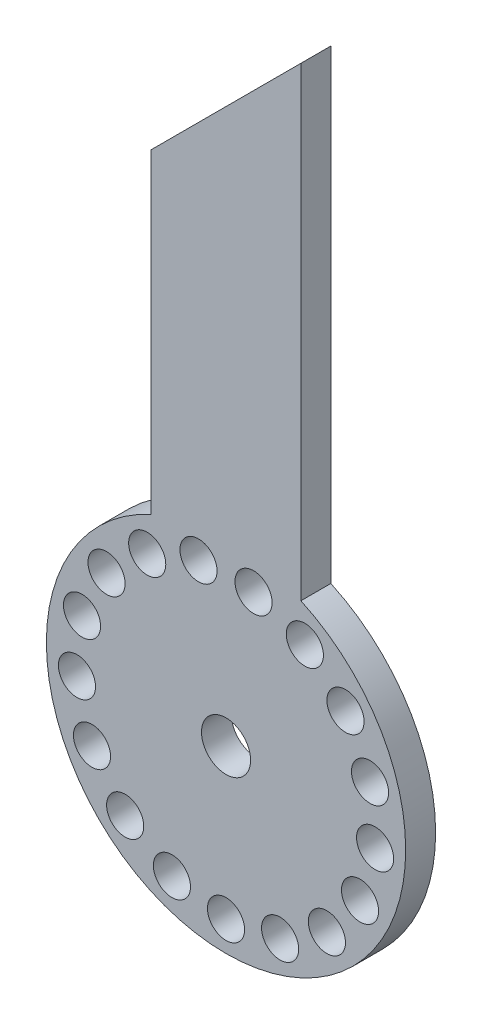
ISO-10303-21;
HEADER;
FILE_DESCRIPTION(('STEP AP214'),'2;1');
FILE_NAME('part.step','',(''),(''),'','','');
FILE_SCHEMA(('AUTOMOTIVE_DESIGN { 1 0 10303 214 1 1 1 1 }'));
ENDSEC;
DATA;
#1=APPLICATION_CONTEXT('core data for automotive mechanical design processes');
#2=APPLICATION_PROTOCOL_DEFINITION('international standard','automotive_design',2000,#1);
#3=PRODUCT_CONTEXT('',#1,'mechanical');
#4=PRODUCT('Part','Part','',(#3));
#5=PRODUCT_RELATED_PRODUCT_CATEGORY('part','',(#4));
#6=PRODUCT_DEFINITION_FORMATION('','',#4);
#7=PRODUCT_DEFINITION_CONTEXT('part definition',#1,'design');
#8=PRODUCT_DEFINITION('design','',#6,#7);
#9=PRODUCT_DEFINITION_SHAPE('','',#8);
#10=(LENGTH_UNIT() NAMED_UNIT(*) SI_UNIT(.MILLI.,.METRE.));
#11=(NAMED_UNIT(*) PLANE_ANGLE_UNIT() SI_UNIT($,.RADIAN.));
#12=(NAMED_UNIT(*) SI_UNIT($,.STERADIAN.) SOLID_ANGLE_UNIT());
#13=UNCERTAINTY_MEASURE_WITH_UNIT(LENGTH_MEASURE(1.E-05),#10,'distance_accuracy_value','');
#14=(GEOMETRIC_REPRESENTATION_CONTEXT(3) GLOBAL_UNCERTAINTY_ASSIGNED_CONTEXT((#13)) GLOBAL_UNIT_ASSIGNED_CONTEXT((#10,
#11,#12)) REPRESENTATION_CONTEXT('',''));
#15=CARTESIAN_POINT('',(0.,0.,0.));
#16=DIRECTION('',(0.,0.,1.));
#17=DIRECTION('',(1.,0.,0.));
#18=AXIS2_PLACEMENT_3D('',#15,#16,#17);
#19=CARTESIAN_POINT('',(0.,0.,5.));
#20=DIRECTION('',(0.,0.,-1.));
#21=DIRECTION('',(-1.,0.,0.));
#22=AXIS2_PLACEMENT_3D('',#19,#20,#21);
#23=CYLINDRICAL_SURFACE('',#22,30.);
#24=CARTESIAN_POINT('',(0.,0.,0.));
#25=DIRECTION('',(0.,0.,1.));
#26=DIRECTION('',(1.,0.,0.));
#27=AXIS2_PLACEMENT_3D('',#24,#25,#26);
#28=CIRCLE('',#27,30.);
#29=CARTESIAN_POINT('',(-12.5,27.2717802865893,0.));
#30=VERTEX_POINT('',#29);
#31=CARTESIAN_POINT('',(12.5,27.2717802865893,0.));
#32=VERTEX_POINT('',#31);
#33=EDGE_CURVE('E93',#30,#32,#28,.T.);
#34=ORIENTED_EDGE('',*,*,#33,.T.);
#35=DIRECTION('',(0.,0.,-1.));
#36=VECTOR('',#35,1.);
#37=CARTESIAN_POINT('',(12.5,27.2717802865893,5.));
#38=LINE('',#37,#36);
#39=CARTESIAN_POINT('',(12.5,27.2717802865893,5.));
#40=VERTEX_POINT('',#39);
#41=EDGE_CURVE('E11',#40,#32,#38,.T.);
#42=ORIENTED_EDGE('',*,*,#41,.F.);
#43=CARTESIAN_POINT('',(0.,0.,5.));
#44=DIRECTION('',(0.,0.,1.));
#45=DIRECTION('',(1.,0.,0.));
#46=AXIS2_PLACEMENT_3D('',#43,#44,#45);
#47=CIRCLE('',#46,30.);
#48=CARTESIAN_POINT('',(-12.5,27.2717802865893,5.));
#49=VERTEX_POINT('',#48);
#50=EDGE_CURVE('E94',#49,#40,#47,.T.);
#51=ORIENTED_EDGE('',*,*,#50,.F.);
#52=DIRECTION('',(0.,0.,-1.));
#53=VECTOR('',#52,1.);
#54=CARTESIAN_POINT('',(-12.5,27.2717802865893,5.));
#55=LINE('',#54,#53);
#56=EDGE_CURVE('E43',#49,#30,#55,.T.);
#57=ORIENTED_EDGE('',*,*,#56,.T.);
#58=EDGE_LOOP('',(#34,#42,#51,#57));
#59=FACE_BOUND('',#58,.T.);
#60=ADVANCED_FACE('F35',(#59),#23,.T.);
#61=CARTESIAN_POINT('',(12.5,150.,5.));
#62=DIRECTION('',(-1.,0.,0.));
#63=DIRECTION('',(0.,-1.,0.));
#64=AXIS2_PLACEMENT_3D('',#61,#62,#63);
#65=PLANE('',#64);
#66=DIRECTION('',(0.,1.,0.));
#67=VECTOR('',#66,1.);
#68=CARTESIAN_POINT('',(12.5,150.,0.));
#69=LINE('',#68,#67);
#70=CARTESIAN_POINT('',(12.5,105.,0.));
#71=VERTEX_POINT('',#70);
#72=EDGE_CURVE('E63',#32,#71,#69,.T.);
#73=ORIENTED_EDGE('',*,*,#72,.T.);
#74=DIRECTION('',(0.,0.,1.));
#75=VECTOR('',#74,1.);
#76=CARTESIAN_POINT('',(12.5,105.,0.));
#77=LINE('',#76,#75);
#78=CARTESIAN_POINT('',(12.5,105.,5.));
#79=VERTEX_POINT('',#78);
#80=EDGE_CURVE('E83',#71,#79,#77,.T.);
#81=ORIENTED_EDGE('',*,*,#80,.T.);
#82=DIRECTION('',(0.,1.,0.));
#83=VECTOR('',#82,1.);
#84=CARTESIAN_POINT('',(12.5,150.,5.));
#85=LINE('',#84,#83);
#86=EDGE_CURVE('E96',#40,#79,#85,.T.);
#87=ORIENTED_EDGE('',*,*,#86,.F.);
#88=ORIENTED_EDGE('',*,*,#41,.T.);
#89=EDGE_LOOP('',(#73,#81,#87,#88));
#90=FACE_BOUND('',#89,.T.);
#91=ADVANCED_FACE('F218',(#90),#65,.F.);
#92=CARTESIAN_POINT('',(-12.5,150.,5.));
#93=DIRECTION('',(1.,0.,0.));
#94=DIRECTION('',(0.,1.,0.));
#95=AXIS2_PLACEMENT_3D('',#92,#93,#94);
#96=PLANE('',#95);
#97=DIRECTION('',(0.,-1.,0.));
#98=VECTOR('',#97,1.);
#99=CARTESIAN_POINT('',(-12.5,150.,5.));
#100=LINE('',#99,#98);
#101=CARTESIAN_POINT('',(-12.5,79.9999999999999,5.));
#102=VERTEX_POINT('',#101);
#103=EDGE_CURVE('E51',#102,#49,#100,.T.);
#104=ORIENTED_EDGE('',*,*,#103,.F.);
#105=DIRECTION('',(0.,0.,1.));
#106=VECTOR('',#105,1.);
#107=CARTESIAN_POINT('',(-12.5,79.9999999999999,0.));
#108=LINE('',#107,#106);
#109=CARTESIAN_POINT('',(-12.5,79.9999999999999,0.));
#110=VERTEX_POINT('',#109);
#111=EDGE_CURVE('E81',#110,#102,#108,.T.);
#112=ORIENTED_EDGE('',*,*,#111,.F.);
#113=DIRECTION('',(0.,-1.,0.));
#114=VECTOR('',#113,1.);
#115=CARTESIAN_POINT('',(-12.5,150.,0.));
#116=LINE('',#115,#114);
#117=EDGE_CURVE('E88',#110,#30,#116,.T.);
#118=ORIENTED_EDGE('',*,*,#117,.T.);
#119=ORIENTED_EDGE('',*,*,#56,.F.);
#120=EDGE_LOOP('',(#104,#112,#118,#119));
#121=FACE_BOUND('',#120,.T.);
#122=ADVANCED_FACE('F87',(#121),#96,.F.);
#123=CARTESIAN_POINT('',(0.,0.,5.));
#124=DIRECTION('',(0.,0.,1.));
#125=DIRECTION('',(1.,0.,0.));
#126=AXIS2_PLACEMENT_3D('',#123,#124,#125);
#127=PLANE('',#126);
#128=DIRECTION('',(0.707106781186548,0.707106781186547,0.));
#129=VECTOR('',#128,1.);
#130=CARTESIAN_POINT('',(-12.5,79.9999999999999,5.));
#131=LINE('',#130,#129);
#132=EDGE_CURVE('E70',#102,#79,#131,.T.);
#133=ORIENTED_EDGE('',*,*,#132,.F.);
#134=ORIENTED_EDGE('',*,*,#103,.T.);
#135=ORIENTED_EDGE('',*,*,#50,.T.);
#136=ORIENTED_EDGE('',*,*,#86,.T.);
#137=EDGE_LOOP('',(#133,#134,#135,#136));
#138=FACE_BOUND('',#137,.T.);
#139=CARTESIAN_POINT('',(9.03104165467851,-23.311805735109,5.));
#140=DIRECTION('',(0.,0.,1.));
#141=DIRECTION('',(1.,0.,0.));
#142=AXIS2_PLACEMENT_3D('',#139,#140,#141);
#143=CIRCLE('',#142,3.1);
#144=CARTESIAN_POINT('',(12.1310416546785,-23.311805735109,5.));
#145=VERTEX_POINT('',#144);
#146=EDGE_CURVE('E211',#145,#145,#143,.T.);
#147=ORIENTED_EDGE('',*,*,#146,.F.);
#148=EDGE_LOOP('',(#147));
#149=FACE_BOUND('',#148,.T.);
#150=CARTESIAN_POINT('',(16.8423910911637,-18.4752229305167,5.));
#151=DIRECTION('',(0.,0.,1.));
#152=DIRECTION('',(1.,0.,0.));
#153=AXIS2_PLACEMENT_3D('',#150,#151,#152);
#154=CIRCLE('',#153,3.1);
#155=CARTESIAN_POINT('',(19.9423910911637,-18.4752229305167,5.));
#156=VERTEX_POINT('',#155);
#157=EDGE_CURVE('E205',#156,#156,#154,.T.);
#158=ORIENTED_EDGE('',*,*,#157,.F.);
#159=EDGE_LOOP('',(#158));
#160=FACE_BOUND('',#159,.T.);
#161=CARTESIAN_POINT('',(22.3790822838764,-11.1434588944137,5.));
#162=DIRECTION('',(0.,0.,1.));
#163=DIRECTION('',(1.,0.,0.));
#164=AXIS2_PLACEMENT_3D('',#161,#162,#163);
#165=CIRCLE('',#164,3.1);
#166=CARTESIAN_POINT('',(25.4790822838764,-11.1434588944137,5.));
#167=VERTEX_POINT('',#166);
#168=EDGE_CURVE('E199',#167,#167,#165,.T.);
#169=ORIENTED_EDGE('',*,*,#168,.F.);
#170=EDGE_LOOP('',(#169));
#171=FACE_BOUND('',#170,.T.);
#172=CARTESIAN_POINT('',(24.8933544073758,-2.30670898658283,5.));
#173=DIRECTION('',(0.,0.,1.));
#174=DIRECTION('',(1.,0.,0.));
#175=AXIS2_PLACEMENT_3D('',#172,#173,#174);
#176=CIRCLE('',#175,3.1);
#177=CARTESIAN_POINT('',(27.9933544073758,-2.30670898658283,5.));
#178=VERTEX_POINT('',#177);
#179=EDGE_CURVE('E193',#178,#178,#176,.T.);
#180=ORIENTED_EDGE('',*,*,#179,.F.);
#181=EDGE_LOOP('',(#180));
#182=FACE_BOUND('',#181,.T.);
#183=CARTESIAN_POINT('',(24.0456410793205,6.84157475180182,5.));
#184=DIRECTION('',(0.,0.,1.));
#185=DIRECTION('',(1.,0.,0.));
#186=AXIS2_PLACEMENT_3D('',#183,#184,#185);
#187=CIRCLE('',#186,3.1);
#188=CARTESIAN_POINT('',(27.1456410793206,6.84157475180182,5.));
#189=VERTEX_POINT('',#188);
#190=EDGE_CURVE('E187',#189,#189,#187,.T.);
#191=ORIENTED_EDGE('',*,*,#190,.F.);
#192=EDGE_LOOP('',(#191));
#193=FACE_BOUND('',#192,.T.);
#194=CARTESIAN_POINT('',(19.9504306820061,15.0658659094812,5.));
#195=DIRECTION('',(0.,0.,1.));
#196=DIRECTION('',(1.,0.,0.));
#197=AXIS2_PLACEMENT_3D('',#194,#195,#196);
#198=CIRCLE('',#197,3.1);
#199=CARTESIAN_POINT('',(23.0504306820061,15.0658659094812,5.));
#200=VERTEX_POINT('',#199);
#201=EDGE_CURVE('E181',#200,#200,#198,.T.);
#202=ORIENTED_EDGE('',*,*,#201,.F.);
#203=EDGE_LOOP('',(#202));
#204=FACE_BOUND('',#203,.T.);
#205=CARTESIAN_POINT('',(13.1608040719341,21.2554283932402,5.));
#206=DIRECTION('',(0.,0.,1.));
#207=DIRECTION('',(1.,0.,0.));
#208=AXIS2_PLACEMENT_3D('',#205,#206,#207);
#209=CIRCLE('',#208,3.1);
#210=CARTESIAN_POINT('',(16.2608040719341,21.2554283932402,5.));
#211=VERTEX_POINT('',#210);
#212=EDGE_CURVE('E175',#211,#211,#209,.T.);
#213=ORIENTED_EDGE('',*,*,#212,.F.);
#214=EDGE_LOOP('',(#213));
#215=FACE_BOUND('',#214,.T.);
#216=CARTESIAN_POINT('',(4.59373794541444,24.5743274920975,5.));
#217=DIRECTION('',(0.,0.,1.));
#218=DIRECTION('',(1.,0.,0.));
#219=AXIS2_PLACEMENT_3D('',#216,#217,#218);
#220=CIRCLE('',#219,3.1);
#221=CARTESIAN_POINT('',(7.69373794541444,24.5743274920975,5.));
#222=VERTEX_POINT('',#221);
#223=EDGE_CURVE('E169',#222,#222,#220,.T.);
#224=ORIENTED_EDGE('',*,*,#223,.F.);
#225=EDGE_LOOP('',(#224));
#226=FACE_BOUND('',#225,.T.);
#227=CARTESIAN_POINT('',(-4.5937379454141,24.5743274920976,5.));
#228=DIRECTION('',(0.,0.,1.));
#229=DIRECTION('',(1.,0.,0.));
#230=AXIS2_PLACEMENT_3D('',#227,#228,#229);
#231=CIRCLE('',#230,3.1);
#232=CARTESIAN_POINT('',(-1.4937379454141,24.5743274920976,5.));
#233=VERTEX_POINT('',#232);
#234=EDGE_CURVE('E163',#233,#233,#231,.T.);
#235=ORIENTED_EDGE('',*,*,#234,.F.);
#236=EDGE_LOOP('',(#235));
#237=FACE_BOUND('',#236,.T.);
#238=CARTESIAN_POINT('',(-13.1608040719338,21.2554283932404,5.));
#239=DIRECTION('',(0.,0.,1.));
#240=DIRECTION('',(1.,0.,0.));
#241=AXIS2_PLACEMENT_3D('',#238,#239,#240);
#242=CIRCLE('',#241,3.1);
#243=CARTESIAN_POINT('',(-10.0608040719338,21.2554283932404,5.));
#244=VERTEX_POINT('',#243);
#245=EDGE_CURVE('E157',#244,#244,#242,.T.);
#246=ORIENTED_EDGE('',*,*,#245,.F.);
#247=EDGE_LOOP('',(#246));
#248=FACE_BOUND('',#247,.T.);
#249=CARTESIAN_POINT('',(-19.9504306820059,15.0658659094815,5.));
#250=DIRECTION('',(0.,0.,1.));
#251=DIRECTION('',(1.,0.,0.));
#252=AXIS2_PLACEMENT_3D('',#249,#250,#251);
#253=CIRCLE('',#252,3.1);
#254=CARTESIAN_POINT('',(-16.8504306820059,15.0658659094815,5.));
#255=VERTEX_POINT('',#254);
#256=EDGE_CURVE('E151',#255,#255,#253,.T.);
#257=ORIENTED_EDGE('',*,*,#256,.F.);
#258=EDGE_LOOP('',(#257));
#259=FACE_BOUND('',#258,.T.);
#260=CARTESIAN_POINT('',(-24.0456410793205,6.84157475180217,5.));
#261=DIRECTION('',(0.,0.,1.));
#262=DIRECTION('',(1.,0.,0.));
#263=AXIS2_PLACEMENT_3D('',#260,#261,#262);
#264=CIRCLE('',#263,3.1);
#265=CARTESIAN_POINT('',(-20.9456410793205,6.84157475180217,5.));
#266=VERTEX_POINT('',#265);
#267=EDGE_CURVE('E145',#266,#266,#264,.T.);
#268=ORIENTED_EDGE('',*,*,#267,.F.);
#269=EDGE_LOOP('',(#268));
#270=FACE_BOUND('',#269,.T.);
#271=CARTESIAN_POINT('',(-24.8933544073759,-2.30670898658247,5.));
#272=DIRECTION('',(0.,0.,1.));
#273=DIRECTION('',(1.,0.,0.));
#274=AXIS2_PLACEMENT_3D('',#271,#272,#273);
#275=CIRCLE('',#274,3.1);
#276=CARTESIAN_POINT('',(-21.7933544073759,-2.30670898658247,5.));
#277=VERTEX_POINT('',#276);
#278=EDGE_CURVE('E139',#277,#277,#275,.T.);
#279=ORIENTED_EDGE('',*,*,#278,.F.);
#280=EDGE_LOOP('',(#279));
#281=FACE_BOUND('',#280,.T.);
#282=CARTESIAN_POINT('',(-22.3790822838766,-11.1434588944134,5.));
#283=DIRECTION('',(0.,0.,1.));
#284=DIRECTION('',(1.,0.,0.));
#285=AXIS2_PLACEMENT_3D('',#282,#283,#284);
#286=CIRCLE('',#285,3.1);
#287=CARTESIAN_POINT('',(-19.2790822838766,-11.1434588944134,5.));
#288=VERTEX_POINT('',#287);
#289=EDGE_CURVE('E133',#288,#288,#286,.T.);
#290=ORIENTED_EDGE('',*,*,#289,.F.);
#291=EDGE_LOOP('',(#290));
#292=FACE_BOUND('',#291,.T.);
#293=CARTESIAN_POINT('',(-16.842391091164,-18.4752229305165,5.));
#294=DIRECTION('',(0.,0.,1.));
#295=DIRECTION('',(1.,0.,0.));
#296=AXIS2_PLACEMENT_3D('',#293,#294,#295);
#297=CIRCLE('',#296,3.1);
#298=CARTESIAN_POINT('',(-13.742391091164,-18.4752229305165,5.));
#299=VERTEX_POINT('',#298);
#300=EDGE_CURVE('E127',#299,#299,#297,.T.);
#301=ORIENTED_EDGE('',*,*,#300,.F.);
#302=EDGE_LOOP('',(#301));
#303=FACE_BOUND('',#302,.T.);
#304=CARTESIAN_POINT('',(-9.03104165467884,-23.3118057351089,5.));
#305=DIRECTION('',(0.,0.,1.));
#306=DIRECTION('',(1.,0.,0.));
#307=AXIS2_PLACEMENT_3D('',#304,#305,#306);
#308=CIRCLE('',#307,3.1);
#309=CARTESIAN_POINT('',(-5.93104165467884,-23.3118057351089,5.));
#310=VERTEX_POINT('',#309);
#311=EDGE_CURVE('E121',#310,#310,#308,.T.);
#312=ORIENTED_EDGE('',*,*,#311,.F.);
#313=EDGE_LOOP('',(#312));
#314=FACE_BOUND('',#313,.T.);
#315=CARTESIAN_POINT('',(0.,-25.,5.));
#316=DIRECTION('',(0.,0.,1.));
#317=DIRECTION('',(1.,0.,0.));
#318=AXIS2_PLACEMENT_3D('',#315,#316,#317);
#319=CIRCLE('',#318,3.1);
#320=CARTESIAN_POINT('',(3.1,-25.,5.));
#321=VERTEX_POINT('',#320);
#322=EDGE_CURVE('E115',#321,#321,#319,.T.);
#323=ORIENTED_EDGE('',*,*,#322,.F.);
#324=EDGE_LOOP('',(#323));
#325=FACE_BOUND('',#324,.T.);
#326=CARTESIAN_POINT('',(0.,0.,5.));
#327=DIRECTION('',(0.,0.,1.));
#328=DIRECTION('',(1.,0.,0.));
#329=AXIS2_PLACEMENT_3D('',#326,#327,#328);
#330=CIRCLE('',#329,4.1);
#331=CARTESIAN_POINT('',(4.1,0.,5.));
#332=VERTEX_POINT('',#331);
#333=EDGE_CURVE('E107',#332,#332,#330,.T.);
#334=ORIENTED_EDGE('',*,*,#333,.F.);
#335=EDGE_LOOP('',(#334));
#336=FACE_BOUND('',#335,.T.);
#337=ADVANCED_FACE('F219',(#138,#149,#160,#171,#182,#193,#204,#215,#226,#237,#248,#259,#270,
#281,#292,#303,#314,#325,#336),#127,.T.);
#338=CARTESIAN_POINT('',(0.,0.,0.));
#339=DIRECTION('',(0.,0.,1.));
#340=DIRECTION('',(1.,0.,0.));
#341=AXIS2_PLACEMENT_3D('',#338,#339,#340);
#342=PLANE('',#341);
#343=CARTESIAN_POINT('',(9.03104165467851,-23.311805735109,0.));
#344=DIRECTION('',(0.,0.,1.));
#345=DIRECTION('',(1.,0.,0.));
#346=AXIS2_PLACEMENT_3D('',#343,#344,#345);
#347=CIRCLE('',#346,3.1);
#348=CARTESIAN_POINT('',(12.1310416546785,-23.311805735109,0.));
#349=VERTEX_POINT('',#348);
#350=EDGE_CURVE('E208',#349,#349,#347,.T.);
#351=ORIENTED_EDGE('',*,*,#350,.T.);
#352=EDGE_LOOP('',(#351));
#353=FACE_BOUND('',#352,.T.);
#354=CARTESIAN_POINT('',(16.8423910911637,-18.4752229305167,0.));
#355=DIRECTION('',(0.,0.,1.));
#356=DIRECTION('',(1.,0.,0.));
#357=AXIS2_PLACEMENT_3D('',#354,#355,#356);
#358=CIRCLE('',#357,3.1);
#359=CARTESIAN_POINT('',(19.9423910911637,-18.4752229305167,0.));
#360=VERTEX_POINT('',#359);
#361=EDGE_CURVE('E202',#360,#360,#358,.T.);
#362=ORIENTED_EDGE('',*,*,#361,.T.);
#363=EDGE_LOOP('',(#362));
#364=FACE_BOUND('',#363,.T.);
#365=CARTESIAN_POINT('',(22.3790822838764,-11.1434588944137,0.));
#366=DIRECTION('',(0.,0.,1.));
#367=DIRECTION('',(1.,0.,0.));
#368=AXIS2_PLACEMENT_3D('',#365,#366,#367);
#369=CIRCLE('',#368,3.1);
#370=CARTESIAN_POINT('',(25.4790822838764,-11.1434588944137,0.));
#371=VERTEX_POINT('',#370);
#372=EDGE_CURVE('E196',#371,#371,#369,.T.);
#373=ORIENTED_EDGE('',*,*,#372,.T.);
#374=EDGE_LOOP('',(#373));
#375=FACE_BOUND('',#374,.T.);
#376=CARTESIAN_POINT('',(24.8933544073758,-2.30670898658283,0.));
#377=DIRECTION('',(0.,0.,1.));
#378=DIRECTION('',(1.,0.,0.));
#379=AXIS2_PLACEMENT_3D('',#376,#377,#378);
#380=CIRCLE('',#379,3.1);
#381=CARTESIAN_POINT('',(27.9933544073758,-2.30670898658283,0.));
#382=VERTEX_POINT('',#381);
#383=EDGE_CURVE('E190',#382,#382,#380,.T.);
#384=ORIENTED_EDGE('',*,*,#383,.T.);
#385=EDGE_LOOP('',(#384));
#386=FACE_BOUND('',#385,.T.);
#387=CARTESIAN_POINT('',(24.0456410793205,6.84157475180182,0.));
#388=DIRECTION('',(0.,0.,1.));
#389=DIRECTION('',(1.,0.,0.));
#390=AXIS2_PLACEMENT_3D('',#387,#388,#389);
#391=CIRCLE('',#390,3.1);
#392=CARTESIAN_POINT('',(27.1456410793206,6.84157475180182,0.));
#393=VERTEX_POINT('',#392);
#394=EDGE_CURVE('E184',#393,#393,#391,.T.);
#395=ORIENTED_EDGE('',*,*,#394,.T.);
#396=EDGE_LOOP('',(#395));
#397=FACE_BOUND('',#396,.T.);
#398=CARTESIAN_POINT('',(19.9504306820061,15.0658659094812,0.));
#399=DIRECTION('',(0.,0.,1.));
#400=DIRECTION('',(1.,0.,0.));
#401=AXIS2_PLACEMENT_3D('',#398,#399,#400);
#402=CIRCLE('',#401,3.1);
#403=CARTESIAN_POINT('',(23.0504306820061,15.0658659094812,0.));
#404=VERTEX_POINT('',#403);
#405=EDGE_CURVE('E178',#404,#404,#402,.T.);
#406=ORIENTED_EDGE('',*,*,#405,.T.);
#407=EDGE_LOOP('',(#406));
#408=FACE_BOUND('',#407,.T.);
#409=CARTESIAN_POINT('',(13.1608040719341,21.2554283932402,0.));
#410=DIRECTION('',(0.,0.,1.));
#411=DIRECTION('',(1.,0.,0.));
#412=AXIS2_PLACEMENT_3D('',#409,#410,#411);
#413=CIRCLE('',#412,3.1);
#414=CARTESIAN_POINT('',(16.2608040719341,21.2554283932402,0.));
#415=VERTEX_POINT('',#414);
#416=EDGE_CURVE('E172',#415,#415,#413,.T.);
#417=ORIENTED_EDGE('',*,*,#416,.T.);
#418=EDGE_LOOP('',(#417));
#419=FACE_BOUND('',#418,.T.);
#420=CARTESIAN_POINT('',(4.59373794541444,24.5743274920975,0.));
#421=DIRECTION('',(0.,0.,1.));
#422=DIRECTION('',(1.,0.,0.));
#423=AXIS2_PLACEMENT_3D('',#420,#421,#422);
#424=CIRCLE('',#423,3.1);
#425=CARTESIAN_POINT('',(7.69373794541444,24.5743274920975,0.));
#426=VERTEX_POINT('',#425);
#427=EDGE_CURVE('E166',#426,#426,#424,.T.);
#428=ORIENTED_EDGE('',*,*,#427,.T.);
#429=EDGE_LOOP('',(#428));
#430=FACE_BOUND('',#429,.T.);
#431=CARTESIAN_POINT('',(-4.5937379454141,24.5743274920976,0.));
#432=DIRECTION('',(0.,0.,1.));
#433=DIRECTION('',(1.,0.,0.));
#434=AXIS2_PLACEMENT_3D('',#431,#432,#433);
#435=CIRCLE('',#434,3.1);
#436=CARTESIAN_POINT('',(-1.4937379454141,24.5743274920976,0.));
#437=VERTEX_POINT('',#436);
#438=EDGE_CURVE('E160',#437,#437,#435,.T.);
#439=ORIENTED_EDGE('',*,*,#438,.T.);
#440=EDGE_LOOP('',(#439));
#441=FACE_BOUND('',#440,.T.);
#442=CARTESIAN_POINT('',(-13.1608040719338,21.2554283932404,0.));
#443=DIRECTION('',(0.,0.,1.));
#444=DIRECTION('',(1.,0.,0.));
#445=AXIS2_PLACEMENT_3D('',#442,#443,#444);
#446=CIRCLE('',#445,3.1);
#447=CARTESIAN_POINT('',(-10.0608040719338,21.2554283932404,0.));
#448=VERTEX_POINT('',#447);
#449=EDGE_CURVE('E154',#448,#448,#446,.T.);
#450=ORIENTED_EDGE('',*,*,#449,.T.);
#451=EDGE_LOOP('',(#450));
#452=FACE_BOUND('',#451,.T.);
#453=CARTESIAN_POINT('',(-19.9504306820059,15.0658659094815,0.));
#454=DIRECTION('',(0.,0.,1.));
#455=DIRECTION('',(1.,0.,0.));
#456=AXIS2_PLACEMENT_3D('',#453,#454,#455);
#457=CIRCLE('',#456,3.1);
#458=CARTESIAN_POINT('',(-16.8504306820059,15.0658659094815,0.));
#459=VERTEX_POINT('',#458);
#460=EDGE_CURVE('E148',#459,#459,#457,.T.);
#461=ORIENTED_EDGE('',*,*,#460,.T.);
#462=EDGE_LOOP('',(#461));
#463=FACE_BOUND('',#462,.T.);
#464=CARTESIAN_POINT('',(-24.0456410793205,6.84157475180217,0.));
#465=DIRECTION('',(0.,0.,1.));
#466=DIRECTION('',(1.,0.,0.));
#467=AXIS2_PLACEMENT_3D('',#464,#465,#466);
#468=CIRCLE('',#467,3.1);
#469=CARTESIAN_POINT('',(-20.9456410793205,6.84157475180217,0.));
#470=VERTEX_POINT('',#469);
#471=EDGE_CURVE('E142',#470,#470,#468,.T.);
#472=ORIENTED_EDGE('',*,*,#471,.T.);
#473=EDGE_LOOP('',(#472));
#474=FACE_BOUND('',#473,.T.);
#475=CARTESIAN_POINT('',(-24.8933544073759,-2.30670898658247,0.));
#476=DIRECTION('',(0.,0.,1.));
#477=DIRECTION('',(1.,0.,0.));
#478=AXIS2_PLACEMENT_3D('',#475,#476,#477);
#479=CIRCLE('',#478,3.1);
#480=CARTESIAN_POINT('',(-21.7933544073759,-2.30670898658247,0.));
#481=VERTEX_POINT('',#480);
#482=EDGE_CURVE('E136',#481,#481,#479,.T.);
#483=ORIENTED_EDGE('',*,*,#482,.T.);
#484=EDGE_LOOP('',(#483));
#485=FACE_BOUND('',#484,.T.);
#486=CARTESIAN_POINT('',(-22.3790822838766,-11.1434588944134,0.));
#487=DIRECTION('',(0.,0.,1.));
#488=DIRECTION('',(1.,0.,0.));
#489=AXIS2_PLACEMENT_3D('',#486,#487,#488);
#490=CIRCLE('',#489,3.1);
#491=CARTESIAN_POINT('',(-19.2790822838766,-11.1434588944134,0.));
#492=VERTEX_POINT('',#491);
#493=EDGE_CURVE('E130',#492,#492,#490,.T.);
#494=ORIENTED_EDGE('',*,*,#493,.T.);
#495=EDGE_LOOP('',(#494));
#496=FACE_BOUND('',#495,.T.);
#497=CARTESIAN_POINT('',(-16.842391091164,-18.4752229305165,0.));
#498=DIRECTION('',(0.,0.,1.));
#499=DIRECTION('',(1.,0.,0.));
#500=AXIS2_PLACEMENT_3D('',#497,#498,#499);
#501=CIRCLE('',#500,3.1);
#502=CARTESIAN_POINT('',(-13.742391091164,-18.4752229305165,0.));
#503=VERTEX_POINT('',#502);
#504=EDGE_CURVE('E124',#503,#503,#501,.T.);
#505=ORIENTED_EDGE('',*,*,#504,.T.);
#506=EDGE_LOOP('',(#505));
#507=FACE_BOUND('',#506,.T.);
#508=CARTESIAN_POINT('',(-9.03104165467884,-23.3118057351089,0.));
#509=DIRECTION('',(0.,0.,1.));
#510=DIRECTION('',(1.,0.,0.));
#511=AXIS2_PLACEMENT_3D('',#508,#509,#510);
#512=CIRCLE('',#511,3.1);
#513=CARTESIAN_POINT('',(-5.93104165467884,-23.3118057351089,0.));
#514=VERTEX_POINT('',#513);
#515=EDGE_CURVE('E118',#514,#514,#512,.T.);
#516=ORIENTED_EDGE('',*,*,#515,.T.);
#517=EDGE_LOOP('',(#516));
#518=FACE_BOUND('',#517,.T.);
#519=CARTESIAN_POINT('',(0.,-25.,0.));
#520=DIRECTION('',(0.,0.,1.));
#521=DIRECTION('',(1.,0.,0.));
#522=AXIS2_PLACEMENT_3D('',#519,#520,#521);
#523=CIRCLE('',#522,3.1);
#524=CARTESIAN_POINT('',(3.1,-25.,0.));
#525=VERTEX_POINT('',#524);
#526=EDGE_CURVE('E112',#525,#525,#523,.T.);
#527=ORIENTED_EDGE('',*,*,#526,.T.);
#528=EDGE_LOOP('',(#527));
#529=FACE_BOUND('',#528,.T.);
#530=CARTESIAN_POINT('',(0.,0.,0.));
#531=DIRECTION('',(0.,0.,1.));
#532=DIRECTION('',(1.,0.,0.));
#533=AXIS2_PLACEMENT_3D('',#530,#531,#532);
#534=CIRCLE('',#533,4.1);
#535=CARTESIAN_POINT('',(4.1,0.,0.));
#536=VERTEX_POINT('',#535);
#537=EDGE_CURVE('E104',#536,#536,#534,.T.);
#538=ORIENTED_EDGE('',*,*,#537,.T.);
#539=EDGE_LOOP('',(#538));
#540=FACE_BOUND('',#539,.T.);
#541=ORIENTED_EDGE('',*,*,#117,.F.);
#542=DIRECTION('',(0.707106781186548,0.707106781186547,0.));
#543=VECTOR('',#542,1.);
#544=CARTESIAN_POINT('',(-12.5,79.9999999999999,0.));
#545=LINE('',#544,#543);
#546=EDGE_CURVE('E78',#110,#71,#545,.T.);
#547=ORIENTED_EDGE('',*,*,#546,.T.);
#548=ORIENTED_EDGE('',*,*,#72,.F.);
#549=ORIENTED_EDGE('',*,*,#33,.F.);
#550=EDGE_LOOP('',(#541,#547,#548,#549));
#551=FACE_BOUND('',#550,.T.);
#552=ADVANCED_FACE('F91',(#353,#364,#375,#386,#397,#408,#419,#430,#441,#452,#463,#474,#485,#496,
#507,#518,#529,#540,#551),#342,.F.);
#553=CARTESIAN_POINT('',(0.,0.,0.));
#554=DIRECTION('',(0.,0.,1.));
#555=DIRECTION('',(1.,0.,0.));
#556=AXIS2_PLACEMENT_3D('',#553,#554,#555);
#557=CYLINDRICAL_SURFACE('',#556,4.1);
#558=ORIENTED_EDGE('',*,*,#537,.F.);
#559=EDGE_LOOP('',(#558));
#560=FACE_BOUND('',#559,.T.);
#561=ORIENTED_EDGE('',*,*,#333,.T.);
#562=EDGE_LOOP('',(#561));
#563=FACE_BOUND('',#562,.T.);
#564=ADVANCED_FACE('F259',(#560,#563),#557,.F.);
#565=CARTESIAN_POINT('',(0.,-25.,0.));
#566=DIRECTION('',(0.,0.,1.));
#567=DIRECTION('',(1.,0.,0.));
#568=AXIS2_PLACEMENT_3D('',#565,#566,#567);
#569=CYLINDRICAL_SURFACE('',#568,3.1);
#570=ORIENTED_EDGE('',*,*,#526,.F.);
#571=EDGE_LOOP('',(#570));
#572=FACE_BOUND('',#571,.T.);
#573=ORIENTED_EDGE('',*,*,#322,.T.);
#574=EDGE_LOOP('',(#573));
#575=FACE_BOUND('',#574,.T.);
#576=ADVANCED_FACE('F261',(#572,#575),#569,.F.);
#577=CARTESIAN_POINT('',(-9.03104165467884,-23.3118057351089,0.));
#578=DIRECTION('',(0.,0.,1.));
#579=DIRECTION('',(1.,0.,0.));
#580=AXIS2_PLACEMENT_3D('',#577,#578,#579);
#581=CYLINDRICAL_SURFACE('',#580,3.1);
#582=ORIENTED_EDGE('',*,*,#515,.F.);
#583=EDGE_LOOP('',(#582));
#584=FACE_BOUND('',#583,.T.);
#585=ORIENTED_EDGE('',*,*,#311,.T.);
#586=EDGE_LOOP('',(#585));
#587=FACE_BOUND('',#586,.T.);
#588=ADVANCED_FACE('F268',(#584,#587),#581,.F.);
#589=CARTESIAN_POINT('',(-16.842391091164,-18.4752229305165,0.));
#590=DIRECTION('',(0.,0.,1.));
#591=DIRECTION('',(1.,0.,0.));
#592=AXIS2_PLACEMENT_3D('',#589,#590,#591);
#593=CYLINDRICAL_SURFACE('',#592,3.1);
#594=ORIENTED_EDGE('',*,*,#504,.F.);
#595=EDGE_LOOP('',(#594));
#596=FACE_BOUND('',#595,.T.);
#597=ORIENTED_EDGE('',*,*,#300,.T.);
#598=EDGE_LOOP('',(#597));
#599=FACE_BOUND('',#598,.T.);
#600=ADVANCED_FACE('F413',(#596,#599),#593,.F.);
#601=CARTESIAN_POINT('',(-22.3790822838766,-11.1434588944134,0.));
#602=DIRECTION('',(0.,0.,1.));
#603=DIRECTION('',(1.,0.,0.));
#604=AXIS2_PLACEMENT_3D('',#601,#602,#603);
#605=CYLINDRICAL_SURFACE('',#604,3.1);
#606=ORIENTED_EDGE('',*,*,#493,.F.);
#607=EDGE_LOOP('',(#606));
#608=FACE_BOUND('',#607,.T.);
#609=ORIENTED_EDGE('',*,*,#289,.T.);
#610=EDGE_LOOP('',(#609));
#611=FACE_BOUND('',#610,.T.);
#612=ADVANCED_FACE('F405',(#608,#611),#605,.F.);
#613=CARTESIAN_POINT('',(-24.8933544073759,-2.30670898658247,0.));
#614=DIRECTION('',(0.,0.,1.));
#615=DIRECTION('',(1.,0.,0.));
#616=AXIS2_PLACEMENT_3D('',#613,#614,#615);
#617=CYLINDRICAL_SURFACE('',#616,3.1);
#618=ORIENTED_EDGE('',*,*,#482,.F.);
#619=EDGE_LOOP('',(#618));
#620=FACE_BOUND('',#619,.T.);
#621=ORIENTED_EDGE('',*,*,#278,.T.);
#622=EDGE_LOOP('',(#621));
#623=FACE_BOUND('',#622,.T.);
#624=ADVANCED_FACE('F397',(#620,#623),#617,.F.);
#625=CARTESIAN_POINT('',(-24.0456410793205,6.84157475180217,0.));
#626=DIRECTION('',(0.,0.,1.));
#627=DIRECTION('',(1.,0.,0.));
#628=AXIS2_PLACEMENT_3D('',#625,#626,#627);
#629=CYLINDRICAL_SURFACE('',#628,3.1);
#630=ORIENTED_EDGE('',*,*,#471,.F.);
#631=EDGE_LOOP('',(#630));
#632=FACE_BOUND('',#631,.T.);
#633=ORIENTED_EDGE('',*,*,#267,.T.);
#634=EDGE_LOOP('',(#633));
#635=FACE_BOUND('',#634,.T.);
#636=ADVANCED_FACE('F389',(#632,#635),#629,.F.);
#637=CARTESIAN_POINT('',(-19.9504306820059,15.0658659094815,0.));
#638=DIRECTION('',(0.,0.,1.));
#639=DIRECTION('',(1.,0.,0.));
#640=AXIS2_PLACEMENT_3D('',#637,#638,#639);
#641=CYLINDRICAL_SURFACE('',#640,3.1);
#642=ORIENTED_EDGE('',*,*,#460,.F.);
#643=EDGE_LOOP('',(#642));
#644=FACE_BOUND('',#643,.T.);
#645=ORIENTED_EDGE('',*,*,#256,.T.);
#646=EDGE_LOOP('',(#645));
#647=FACE_BOUND('',#646,.T.);
#648=ADVANCED_FACE('F381',(#644,#647),#641,.F.);
#649=CARTESIAN_POINT('',(-13.1608040719338,21.2554283932404,0.));
#650=DIRECTION('',(0.,0.,1.));
#651=DIRECTION('',(1.,0.,0.));
#652=AXIS2_PLACEMENT_3D('',#649,#650,#651);
#653=CYLINDRICAL_SURFACE('',#652,3.1);
#654=ORIENTED_EDGE('',*,*,#449,.F.);
#655=EDGE_LOOP('',(#654));
#656=FACE_BOUND('',#655,.T.);
#657=ORIENTED_EDGE('',*,*,#245,.T.);
#658=EDGE_LOOP('',(#657));
#659=FACE_BOUND('',#658,.T.);
#660=ADVANCED_FACE('F373',(#656,#659),#653,.F.);
#661=CARTESIAN_POINT('',(-4.5937379454141,24.5743274920976,0.));
#662=DIRECTION('',(0.,0.,1.));
#663=DIRECTION('',(1.,0.,0.));
#664=AXIS2_PLACEMENT_3D('',#661,#662,#663);
#665=CYLINDRICAL_SURFACE('',#664,3.1);
#666=ORIENTED_EDGE('',*,*,#438,.F.);
#667=EDGE_LOOP('',(#666));
#668=FACE_BOUND('',#667,.T.);
#669=ORIENTED_EDGE('',*,*,#234,.T.);
#670=EDGE_LOOP('',(#669));
#671=FACE_BOUND('',#670,.T.);
#672=ADVANCED_FACE('F365',(#668,#671),#665,.F.);
#673=CARTESIAN_POINT('',(4.59373794541444,24.5743274920975,0.));
#674=DIRECTION('',(0.,0.,1.));
#675=DIRECTION('',(1.,0.,0.));
#676=AXIS2_PLACEMENT_3D('',#673,#674,#675);
#677=CYLINDRICAL_SURFACE('',#676,3.1);
#678=ORIENTED_EDGE('',*,*,#427,.F.);
#679=EDGE_LOOP('',(#678));
#680=FACE_BOUND('',#679,.T.);
#681=ORIENTED_EDGE('',*,*,#223,.T.);
#682=EDGE_LOOP('',(#681));
#683=FACE_BOUND('',#682,.T.);
#684=ADVANCED_FACE('F357',(#680,#683),#677,.F.);
#685=CARTESIAN_POINT('',(13.1608040719341,21.2554283932402,0.));
#686=DIRECTION('',(0.,0.,1.));
#687=DIRECTION('',(1.,0.,0.));
#688=AXIS2_PLACEMENT_3D('',#685,#686,#687);
#689=CYLINDRICAL_SURFACE('',#688,3.1);
#690=ORIENTED_EDGE('',*,*,#416,.F.);
#691=EDGE_LOOP('',(#690));
#692=FACE_BOUND('',#691,.T.);
#693=ORIENTED_EDGE('',*,*,#212,.T.);
#694=EDGE_LOOP('',(#693));
#695=FACE_BOUND('',#694,.T.);
#696=ADVANCED_FACE('F349',(#692,#695),#689,.F.);
#697=CARTESIAN_POINT('',(19.9504306820061,15.0658659094812,0.));
#698=DIRECTION('',(0.,0.,1.));
#699=DIRECTION('',(1.,0.,0.));
#700=AXIS2_PLACEMENT_3D('',#697,#698,#699);
#701=CYLINDRICAL_SURFACE('',#700,3.1);
#702=ORIENTED_EDGE('',*,*,#405,.F.);
#703=EDGE_LOOP('',(#702));
#704=FACE_BOUND('',#703,.T.);
#705=ORIENTED_EDGE('',*,*,#201,.T.);
#706=EDGE_LOOP('',(#705));
#707=FACE_BOUND('',#706,.T.);
#708=ADVANCED_FACE('F341',(#704,#707),#701,.F.);
#709=CARTESIAN_POINT('',(24.0456410793205,6.84157475180182,0.));
#710=DIRECTION('',(0.,0.,1.));
#711=DIRECTION('',(1.,0.,0.));
#712=AXIS2_PLACEMENT_3D('',#709,#710,#711);
#713=CYLINDRICAL_SURFACE('',#712,3.1);
#714=ORIENTED_EDGE('',*,*,#394,.F.);
#715=EDGE_LOOP('',(#714));
#716=FACE_BOUND('',#715,.T.);
#717=ORIENTED_EDGE('',*,*,#190,.T.);
#718=EDGE_LOOP('',(#717));
#719=FACE_BOUND('',#718,.T.);
#720=ADVANCED_FACE('F333',(#716,#719),#713,.F.);
#721=CARTESIAN_POINT('',(24.8933544073758,-2.30670898658283,0.));
#722=DIRECTION('',(0.,0.,1.));
#723=DIRECTION('',(1.,0.,0.));
#724=AXIS2_PLACEMENT_3D('',#721,#722,#723);
#725=CYLINDRICAL_SURFACE('',#724,3.1);
#726=ORIENTED_EDGE('',*,*,#383,.F.);
#727=EDGE_LOOP('',(#726));
#728=FACE_BOUND('',#727,.T.);
#729=ORIENTED_EDGE('',*,*,#179,.T.);
#730=EDGE_LOOP('',(#729));
#731=FACE_BOUND('',#730,.T.);
#732=ADVANCED_FACE('F325',(#728,#731),#725,.F.);
#733=CARTESIAN_POINT('',(22.3790822838764,-11.1434588944137,0.));
#734=DIRECTION('',(0.,0.,1.));
#735=DIRECTION('',(1.,0.,0.));
#736=AXIS2_PLACEMENT_3D('',#733,#734,#735);
#737=CYLINDRICAL_SURFACE('',#736,3.1);
#738=ORIENTED_EDGE('',*,*,#372,.F.);
#739=EDGE_LOOP('',(#738));
#740=FACE_BOUND('',#739,.T.);
#741=ORIENTED_EDGE('',*,*,#168,.T.);
#742=EDGE_LOOP('',(#741));
#743=FACE_BOUND('',#742,.T.);
#744=ADVANCED_FACE('F317',(#740,#743),#737,.F.);
#745=CARTESIAN_POINT('',(16.8423910911637,-18.4752229305167,0.));
#746=DIRECTION('',(0.,0.,1.));
#747=DIRECTION('',(1.,0.,0.));
#748=AXIS2_PLACEMENT_3D('',#745,#746,#747);
#749=CYLINDRICAL_SURFACE('',#748,3.1);
#750=ORIENTED_EDGE('',*,*,#361,.F.);
#751=EDGE_LOOP('',(#750));
#752=FACE_BOUND('',#751,.T.);
#753=ORIENTED_EDGE('',*,*,#157,.T.);
#754=EDGE_LOOP('',(#753));
#755=FACE_BOUND('',#754,.T.);
#756=ADVANCED_FACE('F309',(#752,#755),#749,.F.);
#757=CARTESIAN_POINT('',(9.03104165467851,-23.311805735109,0.));
#758=DIRECTION('',(0.,0.,1.));
#759=DIRECTION('',(1.,0.,0.));
#760=AXIS2_PLACEMENT_3D('',#757,#758,#759);
#761=CYLINDRICAL_SURFACE('',#760,3.1);
#762=ORIENTED_EDGE('',*,*,#350,.F.);
#763=EDGE_LOOP('',(#762));
#764=FACE_BOUND('',#763,.T.);
#765=ORIENTED_EDGE('',*,*,#146,.T.);
#766=EDGE_LOOP('',(#765));
#767=FACE_BOUND('',#766,.T.);
#768=ADVANCED_FACE('F300',(#764,#767),#761,.F.);
#769=CARTESIAN_POINT('',(-12.5,79.9999999999999,0.));
#770=DIRECTION('',(0.707106781186547,-0.707106781186548,0.));
#771=DIRECTION('',(0.707106781186548,0.707106781186547,0.));
#772=AXIS2_PLACEMENT_3D('',#769,#770,#771);
#773=PLANE('',#772);
#774=ORIENTED_EDGE('',*,*,#132,.T.);
#775=ORIENTED_EDGE('',*,*,#80,.F.);
#776=ORIENTED_EDGE('',*,*,#546,.F.);
#777=ORIENTED_EDGE('',*,*,#111,.T.);
#778=EDGE_LOOP('',(#774,#775,#776,#777));
#779=FACE_BOUND('',#778,.T.);
#780=ADVANCED_FACE('F80',(#779),#773,.F.);
#781=CLOSED_SHELL('',(#60,#91,#122,#337,#552,#564,#576,#588,#600,#612,#624,#636,#648,#660,#672,
#684,#696,#708,#720,#732,#744,#756,#768,#780));
#782=MANIFOLD_SOLID_BREP('B2',#781);
#783=ADVANCED_BREP_SHAPE_REPRESENTATION('',(#18,#782),#14);
#784=SHAPE_DEFINITION_REPRESENTATION(#9,#783);
ENDSEC;
END-ISO-10303-21;
